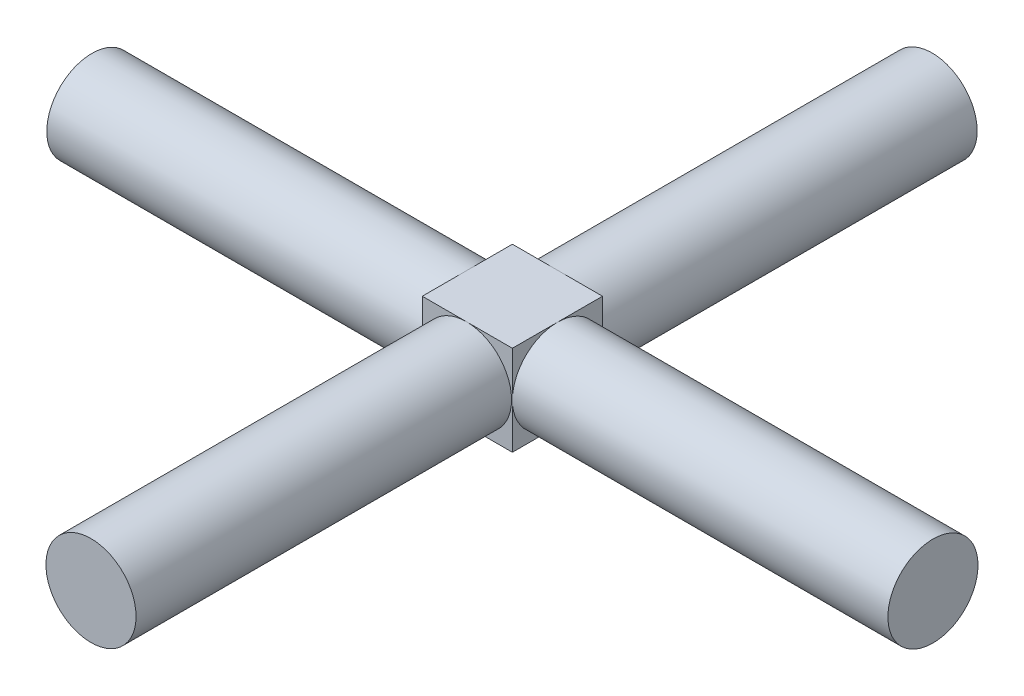
ISO-10303-21;
HEADER;
FILE_DESCRIPTION(('STEP AP214'),'2;1');
FILE_NAME('part.step','',(''),(''),'','','');
FILE_SCHEMA(('AUTOMOTIVE_DESIGN { 1 0 10303 214 1 1 1 1 }'));
ENDSEC;
DATA;
#1=APPLICATION_CONTEXT('core data for automotive mechanical design processes');
#2=APPLICATION_PROTOCOL_DEFINITION('international standard','automotive_design',2000,#1);
#3=PRODUCT_CONTEXT('',#1,'mechanical');
#4=PRODUCT('Part','Part','',(#3));
#5=PRODUCT_RELATED_PRODUCT_CATEGORY('part','',(#4));
#6=PRODUCT_DEFINITION_FORMATION('','',#4);
#7=PRODUCT_DEFINITION_CONTEXT('part definition',#1,'design');
#8=PRODUCT_DEFINITION('design','',#6,#7);
#9=PRODUCT_DEFINITION_SHAPE('','',#8);
#10=(LENGTH_UNIT() NAMED_UNIT(*) SI_UNIT(.MILLI.,.METRE.));
#11=(NAMED_UNIT(*) PLANE_ANGLE_UNIT() SI_UNIT($,.RADIAN.));
#12=(NAMED_UNIT(*) SI_UNIT($,.STERADIAN.) SOLID_ANGLE_UNIT());
#13=UNCERTAINTY_MEASURE_WITH_UNIT(LENGTH_MEASURE(1.E-05),#10,'distance_accuracy_value','');
#14=(GEOMETRIC_REPRESENTATION_CONTEXT(3) GLOBAL_UNCERTAINTY_ASSIGNED_CONTEXT((#13)) GLOBAL_UNIT_ASSIGNED_CONTEXT((#10,
#11,#12)) REPRESENTATION_CONTEXT('',''));
#15=CARTESIAN_POINT('',(0.,0.,0.));
#16=DIRECTION('',(0.,0.,1.));
#17=DIRECTION('',(1.,0.,0.));
#18=AXIS2_PLACEMENT_3D('',#15,#16,#17);
#19=CARTESIAN_POINT('',(-0.75,1.5,0.75));
#20=DIRECTION('',(1.,0.,0.));
#21=DIRECTION('',(0.,0.,-1.));
#22=AXIS2_PLACEMENT_3D('',#19,#20,#21);
#23=PLANE('',#22);
#24=DIRECTION('',(0.,0.,-1.));
#25=VECTOR('',#24,1.);
#26=CARTESIAN_POINT('',(-0.75,0.605813950797442,7.));
#27=LINE('',#26,#25);
#28=CARTESIAN_POINT('',(-0.75,0.605813950797442,-0.75));
#29=VERTEX_POINT('',#28);
#30=CARTESIAN_POINT('',(-0.75,0.605813950797439,-0.736009771141224));
#31=VERTEX_POINT('',#30);
#32=EDGE_CURVE('E50',#29,#31,#27,.F.);
#33=ORIENTED_EDGE('',*,*,#32,.F.);
#34=DIRECTION('',(0.,-1.,0.));
#35=VECTOR('',#34,1.);
#36=CARTESIAN_POINT('',(-0.75,1.5,-0.75));
#37=LINE('',#36,#35);
#38=CARTESIAN_POINT('',(-0.75,0.,-0.75));
#39=VERTEX_POINT('',#38);
#40=EDGE_CURVE('E160',#29,#39,#37,.T.);
#41=ORIENTED_EDGE('',*,*,#40,.T.);
#42=DIRECTION('',(0.,0.,1.));
#43=VECTOR('',#42,1.);
#44=CARTESIAN_POINT('',(-0.75,0.,0.75));
#45=LINE('',#44,#43);
#46=CARTESIAN_POINT('',(-0.75,0.,0.));
#47=VERTEX_POINT('',#46);
#48=EDGE_CURVE('E173',#39,#47,#45,.T.);
#49=ORIENTED_EDGE('',*,*,#48,.T.);
#50=CARTESIAN_POINT('',(-0.75,0.75,0.));
#51=DIRECTION('',(1.,0.,0.));
#52=DIRECTION('',(0.,0.,-1.));
#53=AXIS2_PLACEMENT_3D('',#50,#51,#52);
#54=CIRCLE('',#53,0.75);
#55=EDGE_CURVE('E144',#31,#47,#54,.F.);
#56=ORIENTED_EDGE('',*,*,#55,.F.);
#57=EDGE_LOOP('',(#33,#41,#49,#56));
#58=FACE_BOUND('',#57,.T.);
#59=ADVANCED_FACE('F35',(#58),#23,.F.);
#60=DIRECTION('',(0.,0.,-1.));
#61=VECTOR('',#60,1.);
#62=CARTESIAN_POINT('',(-0.75,0.605813950797442,7.));
#63=LINE('',#62,#61);
#64=CARTESIAN_POINT('',(-0.75,0.605813950797439,0.736009771141224));
#65=VERTEX_POINT('',#64);
#66=CARTESIAN_POINT('',(-0.75,0.605813950797442,0.75));
#67=VERTEX_POINT('',#66);
#68=EDGE_CURVE('E212',#65,#67,#63,.F.);
#69=ORIENTED_EDGE('',*,*,#68,.F.);
#70=EDGE_CURVE('E143',#47,#65,#54,.F.);
#71=ORIENTED_EDGE('',*,*,#70,.F.);
#72=CARTESIAN_POINT('',(-0.75,0.,0.75));
#73=VERTEX_POINT('',#72);
#74=EDGE_CURVE('E176',#47,#73,#45,.T.);
#75=ORIENTED_EDGE('',*,*,#74,.T.);
#76=DIRECTION('',(0.,-1.,0.));
#77=VECTOR('',#76,1.);
#78=CARTESIAN_POINT('',(-0.75,1.5,0.75));
#79=LINE('',#78,#77);
#80=EDGE_CURVE('E164',#67,#73,#79,.T.);
#81=ORIENTED_EDGE('',*,*,#80,.F.);
#82=EDGE_LOOP('',(#69,#71,#75,#81));
#83=FACE_BOUND('',#82,.T.);
#84=ADVANCED_FACE('F244',(#83),#23,.F.);
#85=DIRECTION('',(0.,0.,-1.));
#86=VECTOR('',#85,1.);
#87=CARTESIAN_POINT('',(-0.75,0.894186049202558,7.));
#88=LINE('',#87,#86);
#89=CARTESIAN_POINT('',(-0.75,0.894186049202558,0.75));
#90=VERTEX_POINT('',#89);
#91=CARTESIAN_POINT('',(-0.75,0.894186049202561,0.736009771141224));
#92=VERTEX_POINT('',#91);
#93=EDGE_CURVE('E217',#90,#92,#88,.T.);
#94=ORIENTED_EDGE('',*,*,#93,.F.);
#95=CARTESIAN_POINT('',(-0.75,1.5,0.75));
#96=VERTEX_POINT('',#95);
#97=EDGE_CURVE('E161',#96,#90,#79,.T.);
#98=ORIENTED_EDGE('',*,*,#97,.F.);
#99=DIRECTION('',(0.,0.,1.));
#100=VECTOR('',#99,1.);
#101=CARTESIAN_POINT('',(-0.75,1.5,0.75));
#102=LINE('',#101,#100);
#103=CARTESIAN_POINT('',(-0.75,1.5,0.));
#104=VERTEX_POINT('',#103);
#105=EDGE_CURVE('E192',#104,#96,#102,.T.);
#106=ORIENTED_EDGE('',*,*,#105,.F.);
#107=EDGE_CURVE('E137',#92,#104,#54,.F.);
#108=ORIENTED_EDGE('',*,*,#107,.F.);
#109=EDGE_LOOP('',(#94,#98,#106,#108));
#110=FACE_BOUND('',#109,.T.);
#111=ADVANCED_FACE('F290',(#110),#23,.F.);
#112=CARTESIAN_POINT('',(-0.75,1.5,-0.75));
#113=DIRECTION('',(0.,0.,1.));
#114=DIRECTION('',(1.,0.,0.));
#115=AXIS2_PLACEMENT_3D('',#112,#113,#114);
#116=PLANE('',#115);
#117=CARTESIAN_POINT('',(-0.0139902288587759,0.75,-0.75));
#118=DIRECTION('',(0.,0.,1.));
#119=DIRECTION('',(1.,0.,0.));
#120=AXIS2_PLACEMENT_3D('',#117,#118,#119);
#121=CIRCLE('',#120,0.75);
#122=CARTESIAN_POINT('',(-0.0139902288587759,0.,-0.75));
#123=VERTEX_POINT('',#122);
#124=EDGE_CURVE('E220',#123,#29,#121,.F.);
#125=ORIENTED_EDGE('',*,*,#124,.F.);
#126=DIRECTION('',(-1.,0.,0.));
#127=VECTOR('',#126,1.);
#128=CARTESIAN_POINT('',(-0.75,0.,-0.75));
#129=LINE('',#128,#127);
#130=EDGE_CURVE('E180',#123,#39,#129,.T.);
#131=ORIENTED_EDGE('',*,*,#130,.T.);
#132=ORIENTED_EDGE('',*,*,#40,.F.);
#133=EDGE_LOOP('',(#125,#131,#132));
#134=FACE_BOUND('',#133,.T.);
#135=ADVANCED_FACE('F287',(#134),#116,.F.);
#136=CARTESIAN_POINT('',(-0.75,0.894186049202558,-0.75));
#137=VERTEX_POINT('',#136);
#138=CARTESIAN_POINT('',(-0.0139902288587759,1.5,-0.75));
#139=VERTEX_POINT('',#138);
#140=EDGE_CURVE('E58',#137,#139,#121,.F.);
#141=ORIENTED_EDGE('',*,*,#140,.F.);
#142=CARTESIAN_POINT('',(-0.75,1.5,-0.75));
#143=VERTEX_POINT('',#142);
#144=EDGE_CURVE('E148',#143,#137,#37,.T.);
#145=ORIENTED_EDGE('',*,*,#144,.F.);
#146=DIRECTION('',(-1.,0.,0.));
#147=VECTOR('',#146,1.);
#148=CARTESIAN_POINT('',(-0.75,1.5,-0.75));
#149=LINE('',#148,#147);
#150=EDGE_CURVE('E196',#139,#143,#149,.T.);
#151=ORIENTED_EDGE('',*,*,#150,.F.);
#152=EDGE_LOOP('',(#141,#145,#151));
#153=FACE_BOUND('',#152,.T.);
#154=ADVANCED_FACE('F302',(#153),#116,.F.);
#155=DIRECTION('',(0.,0.,-1.));
#156=VECTOR('',#155,1.);
#157=CARTESIAN_POINT('',(-0.75,0.894186049202558,7.));
#158=LINE('',#157,#156);
#159=CARTESIAN_POINT('',(-0.75,0.894186049202561,-0.736009771141224));
#160=VERTEX_POINT('',#159);
#161=EDGE_CURVE('E146',#160,#137,#158,.T.);
#162=ORIENTED_EDGE('',*,*,#161,.F.);
#163=EDGE_CURVE('E132',#104,#160,#54,.F.);
#164=ORIENTED_EDGE('',*,*,#163,.F.);
#165=EDGE_CURVE('E189',#143,#104,#102,.T.);
#166=ORIENTED_EDGE('',*,*,#165,.F.);
#167=ORIENTED_EDGE('',*,*,#144,.T.);
#168=EDGE_LOOP('',(#162,#164,#166,#167));
#169=FACE_BOUND('',#168,.T.);
#170=ADVANCED_FACE('F147',(#169),#23,.F.);
#171=CARTESIAN_POINT('',(-0.75,1.5,0.75));
#172=DIRECTION('',(0.,0.,-1.));
#173=DIRECTION('',(-1.,0.,0.));
#174=AXIS2_PLACEMENT_3D('',#171,#172,#173);
#175=PLANE('',#174);
#176=CARTESIAN_POINT('',(-0.0139902288587759,0.75,0.75));
#177=DIRECTION('',(0.,0.,-1.));
#178=DIRECTION('',(-1.,0.,0.));
#179=AXIS2_PLACEMENT_3D('',#176,#177,#178);
#180=CIRCLE('',#179,0.75);
#181=CARTESIAN_POINT('',(-0.0139902288587759,0.,0.75));
#182=VERTEX_POINT('',#181);
#183=EDGE_CURVE('E215',#67,#182,#180,.F.);
#184=ORIENTED_EDGE('',*,*,#183,.F.);
#185=ORIENTED_EDGE('',*,*,#80,.T.);
#186=DIRECTION('',(1.,0.,0.));
#187=VECTOR('',#186,1.);
#188=CARTESIAN_POINT('',(-0.75,0.,0.75));
#189=LINE('',#188,#187);
#190=EDGE_CURVE('E168',#73,#182,#189,.T.);
#191=ORIENTED_EDGE('',*,*,#190,.T.);
#192=EDGE_LOOP('',(#184,#185,#191));
#193=FACE_BOUND('',#192,.T.);
#194=ADVANCED_FACE('F249',(#193),#175,.F.);
#195=CARTESIAN_POINT('',(-0.0139902288587759,1.5,0.75));
#196=VERTEX_POINT('',#195);
#197=EDGE_CURVE('E216',#182,#196,#180,.F.);
#198=ORIENTED_EDGE('',*,*,#197,.F.);
#199=CARTESIAN_POINT('',(0.75,0.,0.75));
#200=VERTEX_POINT('',#199);
#201=EDGE_CURVE('E172',#182,#200,#189,.T.);
#202=ORIENTED_EDGE('',*,*,#201,.T.);
#203=DIRECTION('',(0.,-1.,0.));
#204=VECTOR('',#203,1.);
#205=CARTESIAN_POINT('',(0.75,1.5,0.75));
#206=LINE('',#205,#204);
#207=CARTESIAN_POINT('',(0.75,0.75,0.75));
#208=VERTEX_POINT('',#207);
#209=EDGE_CURVE('E167',#208,#200,#206,.T.);
#210=ORIENTED_EDGE('',*,*,#209,.F.);
#211=CARTESIAN_POINT('',(0.75,1.5,0.75));
#212=VERTEX_POINT('',#211);
#213=EDGE_CURVE('E165',#212,#208,#206,.T.);
#214=ORIENTED_EDGE('',*,*,#213,.F.);
#215=DIRECTION('',(1.,0.,0.));
#216=VECTOR('',#215,1.);
#217=CARTESIAN_POINT('',(-0.75,1.5,0.75));
#218=LINE('',#217,#216);
#219=EDGE_CURVE('E188',#196,#212,#218,.T.);
#220=ORIENTED_EDGE('',*,*,#219,.F.);
#221=EDGE_LOOP('',(#198,#202,#210,#214,#220));
#222=FACE_BOUND('',#221,.T.);
#223=ADVANCED_FACE('F254',(#222),#175,.F.);
#224=CARTESIAN_POINT('',(7.,0.75,0.));
#225=DIRECTION('',(-1.,0.,0.));
#226=DIRECTION('',(0.,0.,1.));
#227=AXIS2_PLACEMENT_3D('',#224,#225,#226);
#228=CYLINDRICAL_SURFACE('',#227,0.75);
#229=CARTESIAN_POINT('',(-7.,0.75,0.));
#230=DIRECTION('',(1.,0.,0.));
#231=DIRECTION('',(0.,0.,-1.));
#232=AXIS2_PLACEMENT_3D('',#229,#230,#231);
#233=CIRCLE('',#232,0.75);
#234=CARTESIAN_POINT('',(-7.,0.75,-0.75));
#235=VERTEX_POINT('',#234);
#236=EDGE_CURVE('E206',#235,#235,#233,.T.);
#237=ORIENTED_EDGE('',*,*,#236,.T.);
#238=EDGE_LOOP('',(#237));
#239=FACE_BOUND('',#238,.T.);
#240=CARTESIAN_POINT('',(-0.0139902288587759,0.75,0.));
#241=DIRECTION('',(-0.707106781186547,0.,-0.707106781186547));
#242=DIRECTION('',(-0.707106781186547,0.,0.707106781186547));
#243=AXIS2_PLACEMENT_3D('',#240,#241,#242);
#244=ELLIPSE('',#243,1.06066017177982,0.75);
#245=EDGE_CURVE('E11',#92,#65,#244,.F.);
#246=ORIENTED_EDGE('',*,*,#245,.F.);
#247=ORIENTED_EDGE('',*,*,#107,.T.);
#248=ORIENTED_EDGE('',*,*,#163,.T.);
#249=CARTESIAN_POINT('',(-0.0139902288587759,0.75,0.));
#250=DIRECTION('',(-0.707106781186547,0.,0.707106781186547));
#251=DIRECTION('',(-0.707106781186547,0.,-0.707106781186547));
#252=AXIS2_PLACEMENT_3D('',#249,#250,#251);
#253=ELLIPSE('',#252,1.06066017177982,0.75);
#254=EDGE_CURVE('E43',#31,#160,#253,.F.);
#255=ORIENTED_EDGE('',*,*,#254,.F.);
#256=ORIENTED_EDGE('',*,*,#55,.T.);
#257=ORIENTED_EDGE('',*,*,#70,.T.);
#258=EDGE_LOOP('',(#246,#247,#248,#255,#256,#257));
#259=FACE_BOUND('',#258,.T.);
#260=ADVANCED_FACE('F134',(#239,#259),#228,.T.);
#261=CARTESIAN_POINT('',(0.75,1.5,0.75));
#262=DIRECTION('',(-1.,0.,0.));
#263=DIRECTION('',(0.,0.,1.));
#264=AXIS2_PLACEMENT_3D('',#261,#262,#263);
#265=PLANE('',#264);
#266=CARTESIAN_POINT('',(0.75,0.75,0.));
#267=DIRECTION('',(-1.,0.,0.));
#268=DIRECTION('',(0.,0.,1.));
#269=AXIS2_PLACEMENT_3D('',#266,#267,#268);
#270=CIRCLE('',#269,0.75);
#271=CARTESIAN_POINT('',(0.75,0.,0.));
#272=VERTEX_POINT('',#271);
#273=EDGE_CURVE('E203',#208,#272,#270,.F.);
#274=ORIENTED_EDGE('',*,*,#273,.F.);
#275=ORIENTED_EDGE('',*,*,#209,.T.);
#276=DIRECTION('',(0.,0.,-1.));
#277=VECTOR('',#276,1.);
#278=CARTESIAN_POINT('',(0.75,0.,0.75));
#279=LINE('',#278,#277);
#280=EDGE_CURVE('E181',#200,#272,#279,.T.);
#281=ORIENTED_EDGE('',*,*,#280,.T.);
#282=EDGE_LOOP('',(#274,#275,#281));
#283=FACE_BOUND('',#282,.T.);
#284=ADVANCED_FACE('F267',(#283),#265,.F.);
#285=CARTESIAN_POINT('',(0.75,0.75,-0.75));
#286=VERTEX_POINT('',#285);
#287=EDGE_CURVE('E200',#272,#286,#270,.F.);
#288=ORIENTED_EDGE('',*,*,#287,.F.);
#289=CARTESIAN_POINT('',(0.75,0.,-0.75));
#290=VERTEX_POINT('',#289);
#291=EDGE_CURVE('E184',#272,#290,#279,.T.);
#292=ORIENTED_EDGE('',*,*,#291,.T.);
#293=DIRECTION('',(0.,-1.,0.));
#294=VECTOR('',#293,1.);
#295=CARTESIAN_POINT('',(0.75,1.5,-0.75));
#296=LINE('',#295,#294);
#297=EDGE_CURVE('E156',#286,#290,#296,.T.);
#298=ORIENTED_EDGE('',*,*,#297,.F.);
#299=EDGE_LOOP('',(#288,#292,#298));
#300=FACE_BOUND('',#299,.T.);
#301=ADVANCED_FACE('F278',(#300),#265,.F.);
#302=CARTESIAN_POINT('',(0.75,1.5,0.));
#303=VERTEX_POINT('',#302);
#304=EDGE_CURVE('E141',#286,#303,#270,.F.);
#305=ORIENTED_EDGE('',*,*,#304,.F.);
#306=CARTESIAN_POINT('',(0.75,1.5,-0.75));
#307=VERTEX_POINT('',#306);
#308=EDGE_CURVE('E154',#307,#286,#296,.T.);
#309=ORIENTED_EDGE('',*,*,#308,.F.);
#310=DIRECTION('',(0.,0.,-1.));
#311=VECTOR('',#310,1.);
#312=CARTESIAN_POINT('',(0.75,1.5,0.75));
#313=LINE('',#312,#311);
#314=EDGE_CURVE('E171',#303,#307,#313,.T.);
#315=ORIENTED_EDGE('',*,*,#314,.F.);
#316=EDGE_LOOP('',(#305,#309,#315));
#317=FACE_BOUND('',#316,.T.);
#318=ADVANCED_FACE('F276',(#317),#265,.F.);
#319=EDGE_CURVE('E202',#303,#208,#270,.F.);
#320=ORIENTED_EDGE('',*,*,#319,.F.);
#321=EDGE_CURVE('E197',#212,#303,#313,.T.);
#322=ORIENTED_EDGE('',*,*,#321,.F.);
#323=ORIENTED_EDGE('',*,*,#213,.T.);
#324=EDGE_LOOP('',(#320,#322,#323));
#325=FACE_BOUND('',#324,.T.);
#326=ADVANCED_FACE('F37',(#325),#265,.F.);
#327=EDGE_CURVE('E209',#139,#123,#121,.F.);
#328=ORIENTED_EDGE('',*,*,#327,.F.);
#329=EDGE_CURVE('E193',#307,#139,#149,.T.);
#330=ORIENTED_EDGE('',*,*,#329,.F.);
#331=ORIENTED_EDGE('',*,*,#308,.T.);
#332=ORIENTED_EDGE('',*,*,#297,.T.);
#333=EDGE_CURVE('E177',#290,#123,#129,.T.);
#334=ORIENTED_EDGE('',*,*,#333,.T.);
#335=EDGE_LOOP('',(#328,#330,#331,#332,#334));
#336=FACE_BOUND('',#335,.T.);
#337=ADVANCED_FACE('F281',(#336),#116,.F.);
#338=EDGE_CURVE('E221',#196,#90,#180,.F.);
#339=ORIENTED_EDGE('',*,*,#338,.F.);
#340=EDGE_CURVE('E185',#96,#196,#218,.T.);
#341=ORIENTED_EDGE('',*,*,#340,.F.);
#342=ORIENTED_EDGE('',*,*,#97,.T.);
#343=EDGE_LOOP('',(#339,#341,#342));
#344=FACE_BOUND('',#343,.T.);
#345=ADVANCED_FACE('F294',(#344),#175,.F.);
#346=CARTESIAN_POINT('',(0.,1.5,0.));
#347=DIRECTION('',(0.,-1.,0.));
#348=DIRECTION('',(0.,0.,-1.));
#349=AXIS2_PLACEMENT_3D('',#346,#347,#348);
#350=PLANE('',#349);
#351=ORIENTED_EDGE('',*,*,#329,.T.);
#352=ORIENTED_EDGE('',*,*,#150,.T.);
#353=ORIENTED_EDGE('',*,*,#165,.T.);
#354=ORIENTED_EDGE('',*,*,#105,.T.);
#355=ORIENTED_EDGE('',*,*,#340,.T.);
#356=ORIENTED_EDGE('',*,*,#219,.T.);
#357=ORIENTED_EDGE('',*,*,#321,.T.);
#358=ORIENTED_EDGE('',*,*,#314,.T.);
#359=EDGE_LOOP('',(#351,#352,#353,#354,#355,#356,#357,#358));
#360=FACE_BOUND('',#359,.T.);
#361=ADVANCED_FACE('F283',(#360),#350,.F.);
#362=CARTESIAN_POINT('',(0.,0.,0.));
#363=DIRECTION('',(0.,-1.,0.));
#364=DIRECTION('',(0.,0.,-1.));
#365=AXIS2_PLACEMENT_3D('',#362,#363,#364);
#366=PLANE('',#365);
#367=ORIENTED_EDGE('',*,*,#201,.F.);
#368=ORIENTED_EDGE('',*,*,#190,.F.);
#369=ORIENTED_EDGE('',*,*,#74,.F.);
#370=ORIENTED_EDGE('',*,*,#48,.F.);
#371=ORIENTED_EDGE('',*,*,#130,.F.);
#372=ORIENTED_EDGE('',*,*,#333,.F.);
#373=ORIENTED_EDGE('',*,*,#291,.F.);
#374=ORIENTED_EDGE('',*,*,#280,.F.);
#375=EDGE_LOOP('',(#367,#368,#369,#370,#371,#372,#373,#374));
#376=FACE_BOUND('',#375,.T.);
#377=ADVANCED_FACE('F260',(#376),#366,.T.);
#378=CARTESIAN_POINT('',(-7.,0.75,0.));
#379=DIRECTION('',(1.,0.,0.));
#380=DIRECTION('',(0.,0.,-1.));
#381=AXIS2_PLACEMENT_3D('',#378,#379,#380);
#382=PLANE('',#381);
#383=ORIENTED_EDGE('',*,*,#236,.F.);
#384=EDGE_LOOP('',(#383));
#385=FACE_BOUND('',#384,.T.);
#386=ADVANCED_FACE('F379',(#385),#382,.F.);
#387=CARTESIAN_POINT('',(7.,0.75,0.));
#388=DIRECTION('',(1.,0.,0.));
#389=DIRECTION('',(0.,0.,-1.));
#390=AXIS2_PLACEMENT_3D('',#387,#388,#389);
#391=CIRCLE('',#390,0.75);
#392=CARTESIAN_POINT('',(7.,0.75,-0.75));
#393=VERTEX_POINT('',#392);
#394=EDGE_CURVE('E205',#393,#393,#391,.T.);
#395=ORIENTED_EDGE('',*,*,#394,.F.);
#396=EDGE_LOOP('',(#395));
#397=FACE_BOUND('',#396,.T.);
#398=ORIENTED_EDGE('',*,*,#319,.T.);
#399=ORIENTED_EDGE('',*,*,#273,.T.);
#400=ORIENTED_EDGE('',*,*,#287,.T.);
#401=ORIENTED_EDGE('',*,*,#304,.T.);
#402=EDGE_LOOP('',(#398,#399,#400,#401));
#403=FACE_BOUND('',#402,.T.);
#404=ADVANCED_FACE('F270',(#397,#403),#228,.T.);
#405=CARTESIAN_POINT('',(7.,0.75,0.));
#406=DIRECTION('',(1.,0.,0.));
#407=DIRECTION('',(0.,0.,-1.));
#408=AXIS2_PLACEMENT_3D('',#405,#406,#407);
#409=PLANE('',#408);
#410=ORIENTED_EDGE('',*,*,#394,.T.);
#411=EDGE_LOOP('',(#410));
#412=FACE_BOUND('',#411,.T.);
#413=ADVANCED_FACE('F390',(#412),#409,.T.);
#414=CARTESIAN_POINT('',(-0.0139902288587759,0.75,-7.));
#415=DIRECTION('',(0.,0.,1.));
#416=DIRECTION('',(1.,0.,0.));
#417=AXIS2_PLACEMENT_3D('',#414,#415,#416);
#418=PLANE('',#417);
#419=CARTESIAN_POINT('',(-0.0139902288587759,0.75,-7.));
#420=DIRECTION('',(0.,0.,1.));
#421=DIRECTION('',(1.,0.,0.));
#422=AXIS2_PLACEMENT_3D('',#419,#420,#421);
#423=CIRCLE('',#422,0.75);
#424=CARTESIAN_POINT('',(0.736009771141224,0.75,-7.));
#425=VERTEX_POINT('',#424);
#426=EDGE_CURVE('E226',#425,#425,#423,.T.);
#427=ORIENTED_EDGE('',*,*,#426,.F.);
#428=EDGE_LOOP('',(#427));
#429=FACE_BOUND('',#428,.T.);
#430=ADVANCED_FACE('F385',(#429),#418,.F.);
#431=CARTESIAN_POINT('',(-0.0139902288587759,0.75,7.));
#432=DIRECTION('',(0.,0.,-1.));
#433=DIRECTION('',(-1.,0.,0.));
#434=AXIS2_PLACEMENT_3D('',#431,#432,#433);
#435=CYLINDRICAL_SURFACE('',#434,0.75);
#436=ORIENTED_EDGE('',*,*,#426,.T.);
#437=EDGE_LOOP('',(#436));
#438=FACE_BOUND('',#437,.T.);
#439=ORIENTED_EDGE('',*,*,#140,.T.);
#440=ORIENTED_EDGE('',*,*,#327,.T.);
#441=ORIENTED_EDGE('',*,*,#124,.T.);
#442=ORIENTED_EDGE('',*,*,#32,.T.);
#443=ORIENTED_EDGE('',*,*,#254,.T.);
#444=ORIENTED_EDGE('',*,*,#161,.T.);
#445=EDGE_LOOP('',(#439,#440,#441,#442,#443,#444));
#446=FACE_BOUND('',#445,.T.);
#447=ADVANCED_FACE('F152',(#438,#446),#435,.T.);
#448=CARTESIAN_POINT('',(-0.0139902288587759,0.75,7.));
#449=DIRECTION('',(0.,0.,1.));
#450=DIRECTION('',(1.,0.,0.));
#451=AXIS2_PLACEMENT_3D('',#448,#449,#450);
#452=CIRCLE('',#451,0.75);
#453=CARTESIAN_POINT('',(0.736009771141224,0.75,7.));
#454=VERTEX_POINT('',#453);
#455=EDGE_CURVE('E150',#454,#454,#452,.T.);
#456=ORIENTED_EDGE('',*,*,#455,.F.);
#457=EDGE_LOOP('',(#456));
#458=FACE_BOUND('',#457,.T.);
#459=ORIENTED_EDGE('',*,*,#68,.T.);
#460=ORIENTED_EDGE('',*,*,#183,.T.);
#461=ORIENTED_EDGE('',*,*,#197,.T.);
#462=ORIENTED_EDGE('',*,*,#338,.T.);
#463=ORIENTED_EDGE('',*,*,#93,.T.);
#464=ORIENTED_EDGE('',*,*,#245,.T.);
#465=EDGE_LOOP('',(#459,#460,#461,#462,#463,#464));
#466=FACE_BOUND('',#465,.T.);
#467=ADVANCED_FACE('F234',(#458,#466),#435,.T.);
#468=CARTESIAN_POINT('',(-0.0139902288587759,0.75,7.));
#469=DIRECTION('',(0.,0.,1.));
#470=DIRECTION('',(1.,0.,0.));
#471=AXIS2_PLACEMENT_3D('',#468,#469,#470);
#472=PLANE('',#471);
#473=ORIENTED_EDGE('',*,*,#455,.T.);
#474=EDGE_LOOP('',(#473));
#475=FACE_BOUND('',#474,.T.);
#476=ADVANCED_FACE('F232',(#475),#472,.T.);
#477=CLOSED_SHELL('',(#59,#84,#111,#135,#154,#170,#194,#223,#260,#284,#301,#318,#326,#337,#345,
#361,#377,#386,#404,#413,#430,#447,#467,#476));
#478=MANIFOLD_SOLID_BREP('B2',#477);
#479=ADVANCED_BREP_SHAPE_REPRESENTATION('',(#18,#478),#14);
#480=SHAPE_DEFINITION_REPRESENTATION(#9,#479);
ENDSEC;
END-ISO-10303-21;
